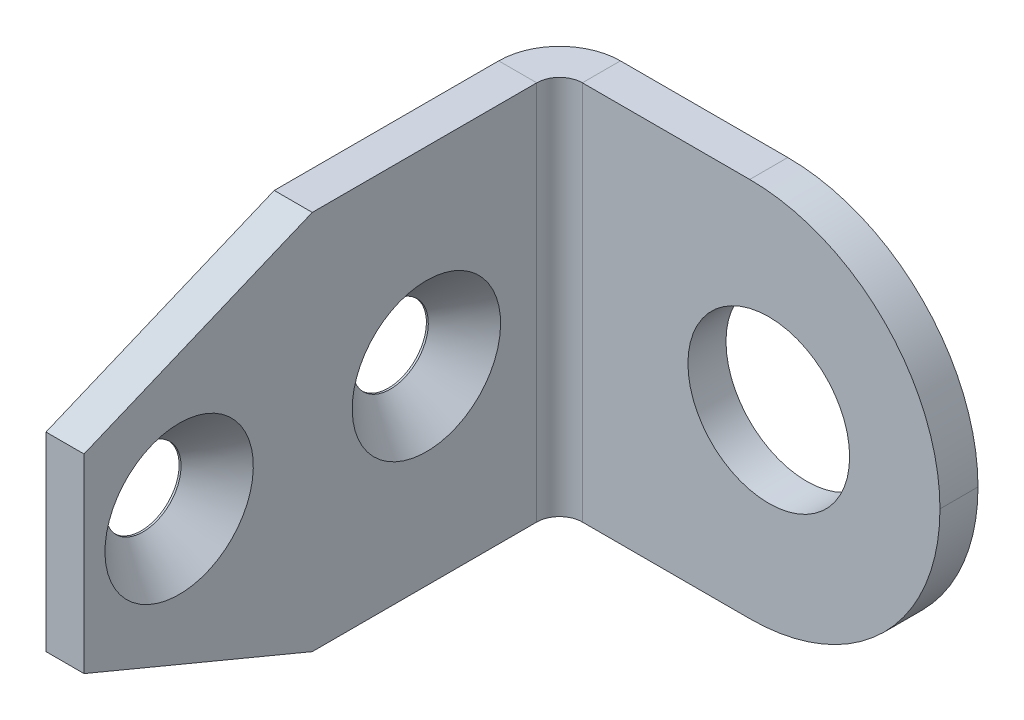
ISO-10303-21;
HEADER;
FILE_DESCRIPTION(('STEP AP214'),'2;1');
FILE_NAME('part.step','',(''),(''),'','','');
FILE_SCHEMA(('AUTOMOTIVE_DESIGN { 1 0 10303 214 1 1 1 1 }'));
ENDSEC;
DATA;
#1=APPLICATION_CONTEXT('core data for automotive mechanical design processes');
#2=APPLICATION_PROTOCOL_DEFINITION('international standard','automotive_design',2000,#1);
#3=PRODUCT_CONTEXT('',#1,'mechanical');
#4=PRODUCT('Part','Part','',(#3));
#5=PRODUCT_RELATED_PRODUCT_CATEGORY('part','',(#4));
#6=PRODUCT_DEFINITION_FORMATION('','',#4);
#7=PRODUCT_DEFINITION_CONTEXT('part definition',#1,'design');
#8=PRODUCT_DEFINITION('design','',#6,#7);
#9=PRODUCT_DEFINITION_SHAPE('','',#8);
#10=(LENGTH_UNIT() NAMED_UNIT(*) SI_UNIT(.MILLI.,.METRE.));
#11=(NAMED_UNIT(*) PLANE_ANGLE_UNIT() SI_UNIT($,.RADIAN.));
#12=(NAMED_UNIT(*) SI_UNIT($,.STERADIAN.) SOLID_ANGLE_UNIT());
#13=UNCERTAINTY_MEASURE_WITH_UNIT(LENGTH_MEASURE(1.E-05),#10,'distance_accuracy_value','');
#14=(GEOMETRIC_REPRESENTATION_CONTEXT(3) GLOBAL_UNCERTAINTY_ASSIGNED_CONTEXT((#13)) GLOBAL_UNIT_ASSIGNED_CONTEXT((#10,
#11,#12)) REPRESENTATION_CONTEXT('',''));
#15=CARTESIAN_POINT('',(0.,0.,0.));
#16=DIRECTION('',(0.,0.,1.));
#17=DIRECTION('',(1.,0.,0.));
#18=AXIS2_PLACEMENT_3D('',#15,#16,#17);
#19=CARTESIAN_POINT('',(-35.9707142128577,17.0113510520487,25.));
#20=DIRECTION('',(1.,0.,0.));
#21=DIRECTION('',(0.,1.,0.));
#22=AXIS2_PLACEMENT_3D('',#19,#20,#21);
#23=PLANE('',#22);
#24=CARTESIAN_POINT('',(-35.9707142128577,7.01135105204873,7.));
#25=DIRECTION('',(1.,0.,0.));
#26=DIRECTION('',(0.,1.,0.));
#27=AXIS2_PLACEMENT_3D('',#24,#25,#26);
#28=CIRCLE('',#27,2.);
#29=CARTESIAN_POINT('',(-35.9707142128577,9.01135105204873,7.));
#30=VERTEX_POINT('',#29);
#31=EDGE_CURVE('E192',#30,#30,#28,.T.);
#32=ORIENTED_EDGE('',*,*,#31,.T.);
#33=EDGE_LOOP('',(#32));
#34=FACE_BOUND('',#33,.T.);
#35=CARTESIAN_POINT('',(-35.9707142128577,7.01135105204873,20.));
#36=DIRECTION('',(1.,0.,0.));
#37=DIRECTION('',(0.,1.,0.));
#38=AXIS2_PLACEMENT_3D('',#35,#36,#37);
#39=CIRCLE('',#38,2.);
#40=CARTESIAN_POINT('',(-35.9707142128577,9.01135105204873,20.));
#41=VERTEX_POINT('',#40);
#42=EDGE_CURVE('E164',#41,#41,#39,.T.);
#43=ORIENTED_EDGE('',*,*,#42,.T.);
#44=EDGE_LOOP('',(#43));
#45=FACE_BOUND('',#44,.T.);
#46=DIRECTION('',(0.,0.,-1.));
#47=VECTOR('',#46,1.);
#48=CARTESIAN_POINT('',(-35.9707142128577,-2.98864894795127,25.));
#49=LINE('',#48,#47);
#50=CARTESIAN_POINT('',(-35.9707142128577,-2.98864894795127,13.));
#51=VERTEX_POINT('',#50);
#52=CARTESIAN_POINT('',(-35.9707142128577,-2.98864894795127,1.19999999999999));
#53=VERTEX_POINT('',#52);
#54=EDGE_CURVE('E138',#51,#53,#49,.T.);
#55=ORIENTED_EDGE('',*,*,#54,.F.);
#56=DIRECTION('',(0.,0.384615384615385,0.923076923076923));
#57=VECTOR('',#56,1.);
#58=CARTESIAN_POINT('',(-35.9707142128577,4.23028596329134,30.3254437869823));
#59=LINE('',#58,#57);
#60=CARTESIAN_POINT('',(-35.9707142128577,2.01135105204873,25.));
#61=VERTEX_POINT('',#60);
#62=EDGE_CURVE('E119',#51,#61,#59,.T.);
#63=ORIENTED_EDGE('',*,*,#62,.T.);
#64=DIRECTION('',(0.,-1.,0.));
#65=VECTOR('',#64,1.);
#66=CARTESIAN_POINT('',(-35.9707142128577,17.0113510520487,25.));
#67=LINE('',#66,#65);
#68=CARTESIAN_POINT('',(-35.9707142128577,12.0113510520487,25.));
#69=VERTEX_POINT('',#68);
#70=EDGE_CURVE('E243',#69,#61,#67,.T.);
#71=ORIENTED_EDGE('',*,*,#70,.F.);
#72=DIRECTION('',(0.,0.384615384615384,-0.923076923076923));
#73=VECTOR('',#72,1.);
#74=CARTESIAN_POINT('',(-35.9707142128577,12.7509960224629,23.2248520710059));
#75=LINE('',#74,#73);
#76=CARTESIAN_POINT('',(-35.9707142128577,17.0113510520487,13.));
#77=VERTEX_POINT('',#76);
#78=EDGE_CURVE('E58',#69,#77,#75,.T.);
#79=ORIENTED_EDGE('',*,*,#78,.T.);
#80=DIRECTION('',(0.,0.,-1.));
#81=VECTOR('',#80,1.);
#82=CARTESIAN_POINT('',(-35.9707142128577,17.0113510520487,25.));
#83=LINE('',#82,#81);
#84=CARTESIAN_POINT('',(-35.9707142128577,17.0113510520487,1.19999999999999));
#85=VERTEX_POINT('',#84);
#86=EDGE_CURVE('E143',#77,#85,#83,.T.);
#87=ORIENTED_EDGE('',*,*,#86,.T.);
#88=DIRECTION('',(0.,1.,0.));
#89=VECTOR('',#88,1.);
#90=CARTESIAN_POINT('',(-35.9707142128577,17.0113510520487,1.19999999999999));
#91=LINE('',#90,#89);
#92=EDGE_CURVE('E225',#85,#53,#91,.F.);
#93=ORIENTED_EDGE('',*,*,#92,.T.);
#94=EDGE_LOOP('',(#55,#63,#71,#79,#87,#93));
#95=FACE_BOUND('',#94,.T.);
#96=ADVANCED_FACE('F35',(#34,#45,#95),#23,.F.);
#97=CARTESIAN_POINT('',(-33.9707142128577,17.0113510520487,25.));
#98=DIRECTION('',(1.,0.,0.));
#99=DIRECTION('',(0.,1.,0.));
#100=AXIS2_PLACEMENT_3D('',#97,#98,#99);
#101=PLANE('',#100);
#102=CARTESIAN_POINT('',(-33.9707142128577,7.01135105204873,20.));
#103=DIRECTION('',(1.,0.,0.));
#104=DIRECTION('',(0.,1.,0.));
#105=AXIS2_PLACEMENT_3D('',#102,#103,#104);
#106=CIRCLE('',#105,3.90000000000002);
#107=CARTESIAN_POINT('',(-33.9707142128577,10.9113510520488,20.));
#108=VERTEX_POINT('',#107);
#109=EDGE_CURVE('E43',#108,#108,#106,.F.);
#110=ORIENTED_EDGE('',*,*,#109,.T.);
#111=EDGE_LOOP('',(#110));
#112=FACE_BOUND('',#111,.T.);
#113=CARTESIAN_POINT('',(-33.9707142128577,7.01135105204873,7.));
#114=DIRECTION('',(1.,0.,0.));
#115=DIRECTION('',(0.,1.,0.));
#116=AXIS2_PLACEMENT_3D('',#113,#114,#115);
#117=CIRCLE('',#116,3.90000000000002);
#118=CARTESIAN_POINT('',(-33.9707142128577,10.9113510520488,7.));
#119=VERTEX_POINT('',#118);
#120=EDGE_CURVE('E171',#119,#119,#117,.F.);
#121=ORIENTED_EDGE('',*,*,#120,.T.);
#122=EDGE_LOOP('',(#121));
#123=FACE_BOUND('',#122,.T.);
#124=DIRECTION('',(0.,0.384615384615385,0.923076923076923));
#125=VECTOR('',#124,1.);
#126=CARTESIAN_POINT('',(-33.9707142128577,2.01135105204873,25.));
#127=LINE('',#126,#125);
#128=CARTESIAN_POINT('',(-33.9707142128577,-2.98864894795127,13.));
#129=VERTEX_POINT('',#128);
#130=CARTESIAN_POINT('',(-33.9707142128577,2.01135105204873,25.));
#131=VERTEX_POINT('',#130);
#132=EDGE_CURVE('E50',#129,#131,#127,.T.);
#133=ORIENTED_EDGE('',*,*,#132,.F.);
#134=DIRECTION('',(0.,0.,-1.));
#135=VECTOR('',#134,1.);
#136=CARTESIAN_POINT('',(-33.9707142128577,-2.98864894795127,25.));
#137=LINE('',#136,#135);
#138=CARTESIAN_POINT('',(-33.9707142128577,-2.98864894795127,1.19999999999999));
#139=VERTEX_POINT('',#138);
#140=EDGE_CURVE('E128',#129,#139,#137,.T.);
#141=ORIENTED_EDGE('',*,*,#140,.T.);
#142=DIRECTION('',(0.,1.,0.));
#143=VECTOR('',#142,1.);
#144=CARTESIAN_POINT('',(-33.9707142128577,17.0113510520487,1.19999999999999));
#145=LINE('',#144,#143);
#146=CARTESIAN_POINT('',(-33.9707142128577,17.0113510520487,1.19999999999999));
#147=VERTEX_POINT('',#146);
#148=EDGE_CURVE('E238',#147,#139,#145,.F.);
#149=ORIENTED_EDGE('',*,*,#148,.F.);
#150=DIRECTION('',(0.,0.,-1.));
#151=VECTOR('',#150,1.);
#152=CARTESIAN_POINT('',(-33.9707142128577,17.0113510520487,25.));
#153=LINE('',#152,#151);
#154=CARTESIAN_POINT('',(-33.9707142128577,17.0113510520487,13.));
#155=VERTEX_POINT('',#154);
#156=EDGE_CURVE('E139',#155,#147,#153,.T.);
#157=ORIENTED_EDGE('',*,*,#156,.F.);
#158=DIRECTION('',(0.,0.384615384615384,-0.923076923076923));
#159=VECTOR('',#158,1.);
#160=CARTESIAN_POINT('',(-33.9707142128577,17.0113510520487,13.));
#161=LINE('',#160,#159);
#162=CARTESIAN_POINT('',(-33.9707142128577,12.0113510520487,25.));
#163=VERTEX_POINT('',#162);
#164=EDGE_CURVE('E501',#163,#155,#161,.T.);
#165=ORIENTED_EDGE('',*,*,#164,.F.);
#166=DIRECTION('',(0.,-1.,0.));
#167=VECTOR('',#166,1.);
#168=CARTESIAN_POINT('',(-33.9707142128577,17.0113510520487,25.));
#169=LINE('',#168,#167);
#170=EDGE_CURVE('E132',#163,#131,#169,.T.);
#171=ORIENTED_EDGE('',*,*,#170,.T.);
#172=EDGE_LOOP('',(#133,#141,#149,#157,#165,#171));
#173=FACE_BOUND('',#172,.T.);
#174=ADVANCED_FACE('F126',(#112,#123,#173),#101,.T.);
#175=CARTESIAN_POINT('',(-35.9707142128577,17.0113510520487,25.));
#176=DIRECTION('',(0.,1.,0.));
#177=DIRECTION('',(0.,0.,1.));
#178=AXIS2_PLACEMENT_3D('',#175,#176,#177);
#179=PLANE('',#178);
#180=DIRECTION('',(1.,0.,0.));
#181=VECTOR('',#180,1.);
#182=CARTESIAN_POINT('',(-38.9707142128577,17.0113510520487,13.));
#183=LINE('',#182,#181);
#184=EDGE_CURVE('E502',#77,#155,#183,.T.);
#185=ORIENTED_EDGE('',*,*,#184,.T.);
#186=ORIENTED_EDGE('',*,*,#156,.T.);
#187=DIRECTION('',(-1.,0.,0.));
#188=VECTOR('',#187,1.);
#189=CARTESIAN_POINT('',(-33.9707142128577,17.0113510520487,1.19999999999999));
#190=LINE('',#189,#188);
#191=EDGE_CURVE('E232',#147,#85,#190,.T.);
#192=ORIENTED_EDGE('',*,*,#191,.T.);
#193=ORIENTED_EDGE('',*,*,#86,.F.);
#194=EDGE_LOOP('',(#185,#186,#192,#193));
#195=FACE_BOUND('',#194,.T.);
#196=ADVANCED_FACE('F255',(#195),#179,.T.);
#197=CARTESIAN_POINT('',(-33.9707142128577,-2.98864894795127,25.));
#198=DIRECTION('',(0.,-1.,0.));
#199=DIRECTION('',(0.,0.,-1.));
#200=AXIS2_PLACEMENT_3D('',#197,#198,#199);
#201=PLANE('',#200);
#202=DIRECTION('',(1.,0.,0.));
#203=VECTOR('',#202,1.);
#204=CARTESIAN_POINT('',(-38.9707142128577,-2.98864894795127,13.));
#205=LINE('',#204,#203);
#206=EDGE_CURVE('E116',#51,#129,#205,.T.);
#207=ORIENTED_EDGE('',*,*,#206,.F.);
#208=ORIENTED_EDGE('',*,*,#54,.T.);
#209=DIRECTION('',(-1.,0.,0.));
#210=VECTOR('',#209,1.);
#211=CARTESIAN_POINT('',(-33.9707142128577,-2.98864894795127,1.19999999999999));
#212=LINE('',#211,#210);
#213=EDGE_CURVE('E136',#139,#53,#212,.T.);
#214=ORIENTED_EDGE('',*,*,#213,.F.);
#215=ORIENTED_EDGE('',*,*,#140,.F.);
#216=EDGE_LOOP('',(#207,#208,#214,#215));
#217=FACE_BOUND('',#216,.T.);
#218=ADVANCED_FACE('F134',(#217),#201,.T.);
#219=CARTESIAN_POINT('',(-35.9707142128577,-2.98864894795127,25.));
#220=DIRECTION('',(0.,0.,-1.));
#221=DIRECTION('',(-1.,0.,0.));
#222=AXIS2_PLACEMENT_3D('',#219,#220,#221);
#223=PLANE('',#222);
#224=ORIENTED_EDGE('',*,*,#70,.T.);
#225=DIRECTION('',(1.,0.,0.));
#226=VECTOR('',#225,1.);
#227=CARTESIAN_POINT('',(-35.9707142128577,2.01135105204873,25.));
#228=LINE('',#227,#226);
#229=EDGE_CURVE('E166',#61,#131,#228,.T.);
#230=ORIENTED_EDGE('',*,*,#229,.T.);
#231=ORIENTED_EDGE('',*,*,#170,.F.);
#232=DIRECTION('',(-1.,0.,0.));
#233=VECTOR('',#232,1.);
#234=CARTESIAN_POINT('',(-35.9707142128577,12.0113510520487,25.));
#235=LINE('',#234,#233);
#236=EDGE_CURVE('E159',#163,#69,#235,.T.);
#237=ORIENTED_EDGE('',*,*,#236,.T.);
#238=EDGE_LOOP('',(#224,#230,#231,#237));
#239=FACE_BOUND('',#238,.T.);
#240=ADVANCED_FACE('F294',(#239),#223,.F.);
#241=CARTESIAN_POINT('',(-32.7707142128577,-2.98864894795127,1.19999999999999));
#242=DIRECTION('',(0.,-1.,0.));
#243=DIRECTION('',(0.,0.,-1.));
#244=AXIS2_PLACEMENT_3D('',#241,#242,#243);
#245=PLANE('',#244);
#246=DIRECTION('',(0.,0.,-1.));
#247=VECTOR('',#246,1.);
#248=CARTESIAN_POINT('',(-32.7707142128577,-2.98864894795127,0.));
#249=LINE('',#248,#247);
#250=CARTESIAN_POINT('',(-32.7707142128577,-2.98864894795127,0.));
#251=VERTEX_POINT('',#250);
#252=CARTESIAN_POINT('',(-32.7707142128577,-2.98864894795127,-2.));
#253=VERTEX_POINT('',#252);
#254=EDGE_CURVE('E203',#251,#253,#249,.T.);
#255=ORIENTED_EDGE('',*,*,#254,.F.);
#256=CARTESIAN_POINT('',(-32.7707142128577,-2.98864894795127,1.19999999999999));
#257=DIRECTION('',(0.,1.,0.));
#258=DIRECTION('',(0.,0.,1.));
#259=AXIS2_PLACEMENT_3D('',#256,#257,#258);
#260=CIRCLE('',#259,1.2);
#261=EDGE_CURVE('E235',#139,#251,#260,.F.);
#262=ORIENTED_EDGE('',*,*,#261,.F.);
#263=ORIENTED_EDGE('',*,*,#213,.T.);
#264=CARTESIAN_POINT('',(-32.7707142128577,-2.98864894795127,1.19999999999999));
#265=DIRECTION('',(0.,1.,0.));
#266=DIRECTION('',(0.,0.,1.));
#267=AXIS2_PLACEMENT_3D('',#264,#265,#266);
#268=CIRCLE('',#267,3.2);
#269=EDGE_CURVE('E228',#53,#253,#268,.F.);
#270=ORIENTED_EDGE('',*,*,#269,.T.);
#271=EDGE_LOOP('',(#255,#262,#263,#270));
#272=FACE_BOUND('',#271,.T.);
#273=ADVANCED_FACE('F292',(#272),#245,.T.);
#274=CARTESIAN_POINT('',(-32.7707142128577,17.0113510520487,1.19999999999999));
#275=DIRECTION('',(0.,-1.,0.));
#276=DIRECTION('',(0.,0.,-1.));
#277=AXIS2_PLACEMENT_3D('',#274,#275,#276);
#278=PLANE('',#277);
#279=CARTESIAN_POINT('',(-32.7707142128577,17.0113510520487,1.19999999999999));
#280=DIRECTION('',(0.,1.,0.));
#281=DIRECTION('',(0.,0.,1.));
#282=AXIS2_PLACEMENT_3D('',#279,#280,#281);
#283=CIRCLE('',#282,1.2);
#284=CARTESIAN_POINT('',(-32.7707142128577,17.0113510520487,0.));
#285=VERTEX_POINT('',#284);
#286=EDGE_CURVE('E221',#285,#147,#283,.T.);
#287=ORIENTED_EDGE('',*,*,#286,.F.);
#288=DIRECTION('',(0.,0.,-1.));
#289=VECTOR('',#288,1.);
#290=CARTESIAN_POINT('',(-32.7707142128577,17.0113510520487,0.));
#291=LINE('',#290,#289);
#292=CARTESIAN_POINT('',(-32.7707142128577,17.0113510520487,-2.));
#293=VERTEX_POINT('',#292);
#294=EDGE_CURVE('E206',#285,#293,#291,.T.);
#295=ORIENTED_EDGE('',*,*,#294,.T.);
#296=CARTESIAN_POINT('',(-32.7707142128577,17.0113510520487,1.19999999999999));
#297=DIRECTION('',(0.,1.,0.));
#298=DIRECTION('',(0.,0.,1.));
#299=AXIS2_PLACEMENT_3D('',#296,#297,#298);
#300=CIRCLE('',#299,3.2);
#301=EDGE_CURVE('E229',#293,#85,#300,.T.);
#302=ORIENTED_EDGE('',*,*,#301,.T.);
#303=ORIENTED_EDGE('',*,*,#191,.F.);
#304=EDGE_LOOP('',(#287,#295,#302,#303));
#305=FACE_BOUND('',#304,.T.);
#306=ADVANCED_FACE('F262',(#305),#278,.F.);
#307=CARTESIAN_POINT('',(-32.7707142128577,17.0113510520487,1.19999999999999));
#308=DIRECTION('',(0.,1.,0.));
#309=DIRECTION('',(0.,0.,-1.));
#310=AXIS2_PLACEMENT_3D('',#307,#308,#309);
#311=CYLINDRICAL_SURFACE('',#310,3.2);
#312=ORIENTED_EDGE('',*,*,#92,.F.);
#313=ORIENTED_EDGE('',*,*,#301,.F.);
#314=DIRECTION('',(0.,-1.,0.));
#315=VECTOR('',#314,1.);
#316=CARTESIAN_POINT('',(-32.7707142128577,17.0113510520487,-2.));
#317=LINE('',#316,#315);
#318=EDGE_CURVE('E209',#293,#253,#317,.T.);
#319=ORIENTED_EDGE('',*,*,#318,.T.);
#320=ORIENTED_EDGE('',*,*,#269,.F.);
#321=EDGE_LOOP('',(#312,#313,#319,#320));
#322=FACE_BOUND('',#321,.T.);
#323=ADVANCED_FACE('F261',(#322),#311,.T.);
#324=CARTESIAN_POINT('',(-32.7707142128577,17.0113510520487,1.19999999999999));
#325=DIRECTION('',(0.,1.,0.));
#326=DIRECTION('',(0.,0.,-1.));
#327=AXIS2_PLACEMENT_3D('',#324,#325,#326);
#328=CYLINDRICAL_SURFACE('',#327,1.2);
#329=ORIENTED_EDGE('',*,*,#148,.T.);
#330=ORIENTED_EDGE('',*,*,#261,.T.);
#331=DIRECTION('',(0.,1.,0.));
#332=VECTOR('',#331,1.);
#333=CARTESIAN_POINT('',(-32.7707142128577,-2.98864894795127,0.));
#334=LINE('',#333,#332);
#335=EDGE_CURVE('E204',#251,#285,#334,.T.);
#336=ORIENTED_EDGE('',*,*,#335,.T.);
#337=ORIENTED_EDGE('',*,*,#286,.T.);
#338=EDGE_LOOP('',(#329,#330,#336,#337));
#339=FACE_BOUND('',#338,.T.);
#340=ADVANCED_FACE('F289',(#339),#328,.F.);
#341=CARTESIAN_POINT('',(-13.9707142128577,17.0113510520487,-2.00000000000007));
#342=DIRECTION('',(0.,-1.,0.));
#343=DIRECTION('',(1.,0.,0.));
#344=AXIS2_PLACEMENT_3D('',#341,#342,#343);
#345=PLANE('',#344);
#346=DIRECTION('',(1.,0.,0.));
#347=VECTOR('',#346,1.);
#348=CARTESIAN_POINT('',(-13.9707142128577,17.0113510520487,0.));
#349=LINE('',#348,#347);
#350=CARTESIAN_POINT('',(-23.9707142128577,17.0113510520487,0.));
#351=VERTEX_POINT('',#350);
#352=EDGE_CURVE('E214',#285,#351,#349,.T.);
#353=ORIENTED_EDGE('',*,*,#352,.T.);
#354=DIRECTION('',(0.,0.,1.));
#355=VECTOR('',#354,1.);
#356=CARTESIAN_POINT('',(-23.9707142128577,17.0113510520487,-2.00000000000003));
#357=LINE('',#356,#355);
#358=CARTESIAN_POINT('',(-23.9707142128577,17.0113510520487,-2.00000000000003));
#359=VERTEX_POINT('',#358);
#360=EDGE_CURVE('E150',#351,#359,#357,.F.);
#361=ORIENTED_EDGE('',*,*,#360,.T.);
#362=DIRECTION('',(1.,0.,0.));
#363=VECTOR('',#362,1.);
#364=CARTESIAN_POINT('',(-13.9707142128577,17.0113510520487,-2.00000000000007));
#365=LINE('',#364,#363);
#366=EDGE_CURVE('E215',#293,#359,#365,.T.);
#367=ORIENTED_EDGE('',*,*,#366,.F.);
#368=ORIENTED_EDGE('',*,*,#294,.F.);
#369=EDGE_LOOP('',(#353,#361,#367,#368));
#370=FACE_BOUND('',#369,.T.);
#371=ADVANCED_FACE('F271',(#370),#345,.F.);
#372=CARTESIAN_POINT('',(-33.9707142128577,-2.98864894795127,-2.));
#373=DIRECTION('',(0.,1.,0.));
#374=DIRECTION('',(-1.,0.,0.));
#375=AXIS2_PLACEMENT_3D('',#372,#373,#374);
#376=PLANE('',#375);
#377=DIRECTION('',(-1.,0.,0.));
#378=VECTOR('',#377,1.);
#379=CARTESIAN_POINT('',(-33.9707142128577,-2.98864894795127,-2.));
#380=LINE('',#379,#378);
#381=CARTESIAN_POINT('',(-23.9707142128577,-2.98864894795127,-2.00000000000004));
#382=VERTEX_POINT('',#381);
#383=EDGE_CURVE('E218',#382,#253,#380,.T.);
#384=ORIENTED_EDGE('',*,*,#383,.F.);
#385=DIRECTION('',(0.,0.,1.));
#386=VECTOR('',#385,1.);
#387=CARTESIAN_POINT('',(-23.9707142128577,-2.98864894795127,-2.00000000000004));
#388=LINE('',#387,#386);
#389=CARTESIAN_POINT('',(-23.9707142128577,-2.98864894795127,0.));
#390=VERTEX_POINT('',#389);
#391=EDGE_CURVE('E157',#382,#390,#388,.T.);
#392=ORIENTED_EDGE('',*,*,#391,.T.);
#393=DIRECTION('',(-1.,0.,0.));
#394=VECTOR('',#393,1.);
#395=CARTESIAN_POINT('',(-33.9707142128577,-2.98864894795127,0.));
#396=LINE('',#395,#394);
#397=EDGE_CURVE('E219',#390,#251,#396,.T.);
#398=ORIENTED_EDGE('',*,*,#397,.T.);
#399=ORIENTED_EDGE('',*,*,#254,.T.);
#400=EDGE_LOOP('',(#384,#392,#398,#399));
#401=FACE_BOUND('',#400,.T.);
#402=ADVANCED_FACE('F283',(#401),#376,.F.);
#403=CARTESIAN_POINT('',(-33.9707142128577,17.0113510520487,-2.));
#404=DIRECTION('',(0.,0.,1.));
#405=DIRECTION('',(1.,0.,0.));
#406=AXIS2_PLACEMENT_3D('',#403,#404,#405);
#407=PLANE('',#406);
#408=CARTESIAN_POINT('',(-22.9707142128577,7.01135105204873,-2.00000000000004));
#409=DIRECTION('',(0.,0.,1.));
#410=DIRECTION('',(1.,0.,0.));
#411=AXIS2_PLACEMENT_3D('',#408,#409,#410);
#412=CIRCLE('',#411,4.25);
#413=CARTESIAN_POINT('',(-18.7207142128577,7.01135105204873,-2.00000000000005));
#414=VERTEX_POINT('',#413);
#415=EDGE_CURVE('E200',#414,#414,#412,.T.);
#416=ORIENTED_EDGE('',*,*,#415,.T.);
#417=EDGE_LOOP('',(#416));
#418=FACE_BOUND('',#417,.T.);
#419=ORIENTED_EDGE('',*,*,#366,.T.);
#420=CARTESIAN_POINT('',(-23.9707142128577,7.01135105204873,-2.00000000000004));
#421=DIRECTION('',(0.,0.,1.));
#422=DIRECTION('',(1.,0.,0.));
#423=AXIS2_PLACEMENT_3D('',#420,#421,#422);
#424=CIRCLE('',#423,10.);
#425=CARTESIAN_POINT('',(-13.9707142128577,7.01135105204873,-2.00000000000007));
#426=VERTEX_POINT('',#425);
#427=EDGE_CURVE('E155',#359,#426,#424,.F.);
#428=ORIENTED_EDGE('',*,*,#427,.T.);
#429=CARTESIAN_POINT('',(-23.9707142128577,7.01135105204873,-2.00000000000004));
#430=DIRECTION('',(0.,0.,1.));
#431=DIRECTION('',(1.,0.,0.));
#432=AXIS2_PLACEMENT_3D('',#429,#430,#431);
#433=CIRCLE('',#432,10.);
#434=EDGE_CURVE('E153',#426,#382,#433,.F.);
#435=ORIENTED_EDGE('',*,*,#434,.T.);
#436=ORIENTED_EDGE('',*,*,#383,.T.);
#437=ORIENTED_EDGE('',*,*,#318,.F.);
#438=EDGE_LOOP('',(#419,#428,#435,#436,#437));
#439=FACE_BOUND('',#438,.T.);
#440=ADVANCED_FACE('F269',(#418,#439),#407,.F.);
#441=CARTESIAN_POINT('',(-33.9707142128577,17.0113510520487,0.));
#442=DIRECTION('',(0.,0.,1.));
#443=DIRECTION('',(1.,0.,0.));
#444=AXIS2_PLACEMENT_3D('',#441,#442,#443);
#445=PLANE('',#444);
#446=CARTESIAN_POINT('',(-22.9707142128577,7.01135105204873,0.));
#447=DIRECTION('',(0.,0.,1.));
#448=DIRECTION('',(1.,0.,0.));
#449=AXIS2_PLACEMENT_3D('',#446,#447,#448);
#450=CIRCLE('',#449,4.25);
#451=CARTESIAN_POINT('',(-18.7207142128577,7.01135105204873,0.));
#452=VERTEX_POINT('',#451);
#453=EDGE_CURVE('E163',#452,#452,#450,.T.);
#454=ORIENTED_EDGE('',*,*,#453,.F.);
#455=EDGE_LOOP('',(#454));
#456=FACE_BOUND('',#455,.T.);
#457=CARTESIAN_POINT('',(-23.9707142128577,7.01135105204873,0.));
#458=DIRECTION('',(0.,0.,1.));
#459=DIRECTION('',(1.,0.,0.));
#460=AXIS2_PLACEMENT_3D('',#457,#458,#459);
#461=CIRCLE('',#460,10.);
#462=CARTESIAN_POINT('',(-13.9707142128577,7.01135105204873,0.));
#463=VERTEX_POINT('',#462);
#464=EDGE_CURVE('E141',#390,#463,#461,.T.);
#465=ORIENTED_EDGE('',*,*,#464,.T.);
#466=CARTESIAN_POINT('',(-23.9707142128577,7.01135105204873,0.));
#467=DIRECTION('',(0.,0.,1.));
#468=DIRECTION('',(1.,0.,0.));
#469=AXIS2_PLACEMENT_3D('',#466,#467,#468);
#470=CIRCLE('',#469,10.);
#471=EDGE_CURVE('E148',#463,#351,#470,.T.);
#472=ORIENTED_EDGE('',*,*,#471,.T.);
#473=ORIENTED_EDGE('',*,*,#352,.F.);
#474=ORIENTED_EDGE('',*,*,#335,.F.);
#475=ORIENTED_EDGE('',*,*,#397,.F.);
#476=EDGE_LOOP('',(#465,#472,#473,#474,#475));
#477=FACE_BOUND('',#476,.T.);
#478=ADVANCED_FACE('F287',(#456,#477),#445,.T.);
#479=CARTESIAN_POINT('',(-22.9707142128577,7.01135105204873,-10.));
#480=DIRECTION('',(0.,0.,1.));
#481=DIRECTION('',(1.,0.,0.));
#482=AXIS2_PLACEMENT_3D('',#479,#480,#481);
#483=CYLINDRICAL_SURFACE('',#482,4.25);
#484=ORIENTED_EDGE('',*,*,#453,.T.);
#485=EDGE_LOOP('',(#484));
#486=FACE_BOUND('',#485,.T.);
#487=ORIENTED_EDGE('',*,*,#415,.F.);
#488=EDGE_LOOP('',(#487));
#489=FACE_BOUND('',#488,.T.);
#490=ADVANCED_FACE('F317',(#486,#489),#483,.F.);
#491=CARTESIAN_POINT('',(-23.9707142128577,7.01135105204873,-2.00000000000004));
#492=DIRECTION('',(0.,0.,1.));
#493=DIRECTION('',(1.,0.,0.));
#494=AXIS2_PLACEMENT_3D('',#491,#492,#493);
#495=CYLINDRICAL_SURFACE('',#494,10.);
#496=ORIENTED_EDGE('',*,*,#391,.F.);
#497=ORIENTED_EDGE('',*,*,#434,.F.);
#498=DIRECTION('',(0.,0.,1.));
#499=VECTOR('',#498,1.);
#500=CARTESIAN_POINT('',(-13.9707142128577,7.01135105204873,-2.00000000000007));
#501=LINE('',#500,#499);
#502=EDGE_CURVE('E160',#463,#426,#501,.F.);
#503=ORIENTED_EDGE('',*,*,#502,.F.);
#504=ORIENTED_EDGE('',*,*,#464,.F.);
#505=EDGE_LOOP('',(#496,#497,#503,#504));
#506=FACE_BOUND('',#505,.T.);
#507=ADVANCED_FACE('F279',(#506),#495,.T.);
#508=CARTESIAN_POINT('',(-23.9707142128577,7.01135105204873,-2.00000000000003));
#509=DIRECTION('',(0.,0.,1.));
#510=DIRECTION('',(1.,0.,0.));
#511=AXIS2_PLACEMENT_3D('',#508,#509,#510);
#512=CYLINDRICAL_SURFACE('',#511,10.);
#513=ORIENTED_EDGE('',*,*,#427,.F.);
#514=ORIENTED_EDGE('',*,*,#360,.F.);
#515=ORIENTED_EDGE('',*,*,#471,.F.);
#516=ORIENTED_EDGE('',*,*,#502,.T.);
#517=EDGE_LOOP('',(#513,#514,#515,#516));
#518=FACE_BOUND('',#517,.T.);
#519=ADVANCED_FACE('F187',(#518),#512,.T.);
#520=CARTESIAN_POINT('',(-43.9707142128577,7.01135105204873,20.));
#521=DIRECTION('',(1.,0.,0.));
#522=DIRECTION('',(0.,1.,0.));
#523=AXIS2_PLACEMENT_3D('',#520,#521,#522);
#524=CYLINDRICAL_SURFACE('',#523,2.);
#525=CARTESIAN_POINT('',(-35.8707142128577,7.01135105204873,20.));
#526=DIRECTION('',(1.,0.,0.));
#527=DIRECTION('',(0.,1.,0.));
#528=AXIS2_PLACEMENT_3D('',#525,#526,#527);
#529=CIRCLE('',#528,2.);
#530=CARTESIAN_POINT('',(-35.8707142128577,9.01135105204873,20.));
#531=VERTEX_POINT('',#530);
#532=EDGE_CURVE('E168',#531,#531,#529,.T.);
#533=ORIENTED_EDGE('',*,*,#532,.T.);
#534=EDGE_LOOP('',(#533));
#535=FACE_BOUND('',#534,.T.);
#536=ORIENTED_EDGE('',*,*,#42,.F.);
#537=EDGE_LOOP('',(#536));
#538=FACE_BOUND('',#537,.T.);
#539=ADVANCED_FACE('F183',(#535,#538),#524,.F.);
#540=CARTESIAN_POINT('',(-43.9707142128577,7.01135105204873,7.));
#541=DIRECTION('',(1.,0.,0.));
#542=DIRECTION('',(0.,1.,0.));
#543=AXIS2_PLACEMENT_3D('',#540,#541,#542);
#544=CYLINDRICAL_SURFACE('',#543,2.);
#545=CARTESIAN_POINT('',(-35.8707142128577,7.01135105204873,7.));
#546=DIRECTION('',(1.,0.,0.));
#547=DIRECTION('',(0.,1.,0.));
#548=AXIS2_PLACEMENT_3D('',#545,#546,#547);
#549=CIRCLE('',#548,2.);
#550=CARTESIAN_POINT('',(-35.8707142128577,9.01135105204873,7.));
#551=VERTEX_POINT('',#550);
#552=EDGE_CURVE('E11',#551,#551,#549,.T.);
#553=ORIENTED_EDGE('',*,*,#552,.T.);
#554=EDGE_LOOP('',(#553));
#555=FACE_BOUND('',#554,.T.);
#556=ORIENTED_EDGE('',*,*,#31,.F.);
#557=EDGE_LOOP('',(#556));
#558=FACE_BOUND('',#557,.T.);
#559=ADVANCED_FACE('F186',(#555,#558),#544,.F.);
#560=CARTESIAN_POINT('',(-38.9707142128577,17.0113510520487,13.));
#561=DIRECTION('',(0.,-0.923076923076923,-0.384615384615384));
#562=DIRECTION('',(0.,0.384615384615384,-0.923076923076923));
#563=AXIS2_PLACEMENT_3D('',#560,#561,#562);
#564=PLANE('',#563);
#565=ORIENTED_EDGE('',*,*,#236,.F.);
#566=ORIENTED_EDGE('',*,*,#164,.T.);
#567=ORIENTED_EDGE('',*,*,#184,.F.);
#568=ORIENTED_EDGE('',*,*,#78,.F.);
#569=EDGE_LOOP('',(#565,#566,#567,#568));
#570=FACE_BOUND('',#569,.T.);
#571=ADVANCED_FACE('F408',(#570),#564,.F.);
#572=CARTESIAN_POINT('',(-38.9707142128577,2.01135105204873,25.));
#573=DIRECTION('',(0.,0.923076923076923,-0.384615384615385));
#574=DIRECTION('',(0.,0.384615384615385,0.923076923076923));
#575=AXIS2_PLACEMENT_3D('',#572,#573,#574);
#576=PLANE('',#575);
#577=ORIENTED_EDGE('',*,*,#206,.T.);
#578=ORIENTED_EDGE('',*,*,#132,.T.);
#579=ORIENTED_EDGE('',*,*,#229,.F.);
#580=ORIENTED_EDGE('',*,*,#62,.F.);
#581=EDGE_LOOP('',(#577,#578,#579,#580));
#582=FACE_BOUND('',#581,.T.);
#583=ADVANCED_FACE('F117',(#582),#576,.F.);
#584=CARTESIAN_POINT('',(-35.8707142128577,7.01135105204873,20.));
#585=DIRECTION('',(1.,0.,0.));
#586=DIRECTION('',(0.,1.,0.));
#587=AXIS2_PLACEMENT_3D('',#584,#585,#586);
#588=CONICAL_SURFACE('',#587,2.,0.785398163397454);
#589=ORIENTED_EDGE('',*,*,#109,.F.);
#590=EDGE_LOOP('',(#589));
#591=FACE_BOUND('',#590,.T.);
#592=ORIENTED_EDGE('',*,*,#532,.F.);
#593=EDGE_LOOP('',(#592));
#594=FACE_BOUND('',#593,.T.);
#595=ADVANCED_FACE('F178',(#591,#594),#588,.F.);
#596=CARTESIAN_POINT('',(-35.8707142128577,7.01135105204873,7.));
#597=DIRECTION('',(1.,0.,0.));
#598=DIRECTION('',(0.,1.,0.));
#599=AXIS2_PLACEMENT_3D('',#596,#597,#598);
#600=CONICAL_SURFACE('',#599,2.,0.785398163397454);
#601=ORIENTED_EDGE('',*,*,#120,.F.);
#602=EDGE_LOOP('',(#601));
#603=FACE_BOUND('',#602,.T.);
#604=ORIENTED_EDGE('',*,*,#552,.F.);
#605=EDGE_LOOP('',(#604));
#606=FACE_BOUND('',#605,.T.);
#607=ADVANCED_FACE('F37',(#603,#606),#600,.F.);
#608=CLOSED_SHELL('',(#96,#174,#196,#218,#240,#273,#306,#323,#340,#371,#402,#440,#478,#490,#507,
#519,#539,#559,#571,#583,#595,#607));
#609=MANIFOLD_SOLID_BREP('B2',#608);
#610=ADVANCED_BREP_SHAPE_REPRESENTATION('',(#18,#609),#14);
#611=SHAPE_DEFINITION_REPRESENTATION(#9,#610);
ENDSEC;
END-ISO-10303-21;
